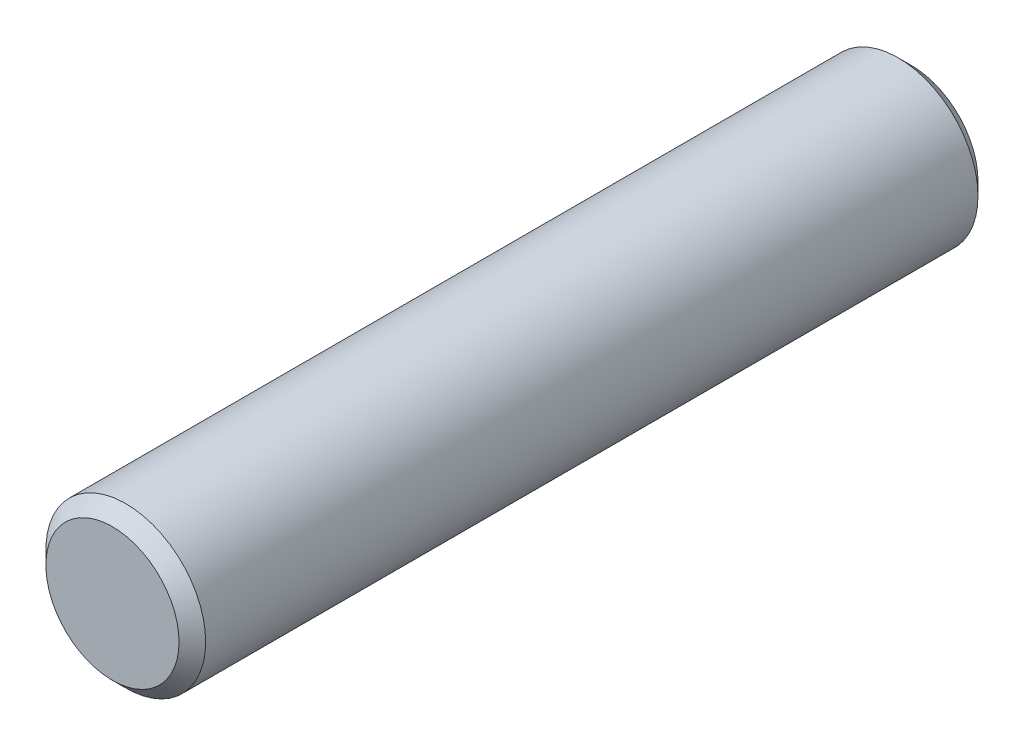
ISO-10303-21;
HEADER;
FILE_DESCRIPTION(('STEP AP214'),'2;1');
FILE_NAME('part.step','',(''),(''),'','','');
FILE_SCHEMA(('AUTOMOTIVE_DESIGN { 1 0 10303 214 1 1 1 1 }'));
ENDSEC;
DATA;
#1=APPLICATION_CONTEXT('core data for automotive mechanical design processes');
#2=APPLICATION_PROTOCOL_DEFINITION('international standard','automotive_design',2000,#1);
#3=PRODUCT_CONTEXT('',#1,'mechanical');
#4=PRODUCT('Part','Part','',(#3));
#5=PRODUCT_RELATED_PRODUCT_CATEGORY('part','',(#4));
#6=PRODUCT_DEFINITION_FORMATION('','',#4);
#7=PRODUCT_DEFINITION_CONTEXT('part definition',#1,'design');
#8=PRODUCT_DEFINITION('design','',#6,#7);
#9=PRODUCT_DEFINITION_SHAPE('','',#8);
#10=(LENGTH_UNIT() NAMED_UNIT(*) SI_UNIT(.MILLI.,.METRE.));
#11=(NAMED_UNIT(*) PLANE_ANGLE_UNIT() SI_UNIT($,.RADIAN.));
#12=(NAMED_UNIT(*) SI_UNIT($,.STERADIAN.) SOLID_ANGLE_UNIT());
#13=UNCERTAINTY_MEASURE_WITH_UNIT(LENGTH_MEASURE(1.E-05),#10,'distance_accuracy_value','');
#14=(GEOMETRIC_REPRESENTATION_CONTEXT(3) GLOBAL_UNCERTAINTY_ASSIGNED_CONTEXT((#13)) GLOBAL_UNIT_ASSIGNED_CONTEXT((#10,
#11,#12)) REPRESENTATION_CONTEXT('',''));
#15=CARTESIAN_POINT('',(0.,0.,0.));
#16=DIRECTION('',(0.,0.,1.));
#17=DIRECTION('',(1.,0.,0.));
#18=AXIS2_PLACEMENT_3D('',#15,#16,#17);
#19=CARTESIAN_POINT('',(0.,0.,30.));
#20=DIRECTION('',(0.,0.,-1.));
#21=DIRECTION('',(-1.,0.,0.));
#22=AXIS2_PLACEMENT_3D('',#19,#20,#21);
#23=CYLINDRICAL_SURFACE('',#22,3.);
#24=CARTESIAN_POINT('',(0.,0.,29.5));
#25=DIRECTION('',(0.,0.,1.));
#26=DIRECTION('',(1.,0.,0.));
#27=AXIS2_PLACEMENT_3D('',#24,#25,#26);
#28=CIRCLE('',#27,3.);
#29=CARTESIAN_POINT('',(3.,0.,29.5));
#30=VERTEX_POINT('',#29);
#31=EDGE_CURVE('E37',#30,#30,#28,.F.);
#32=ORIENTED_EDGE('',*,*,#31,.T.);
#33=EDGE_LOOP('',(#32));
#34=FACE_BOUND('',#33,.T.);
#35=CARTESIAN_POINT('',(0.,0.,0.500000000000007));
#36=DIRECTION('',(0.,0.,1.));
#37=DIRECTION('',(1.,0.,0.));
#38=AXIS2_PLACEMENT_3D('',#35,#36,#37);
#39=CIRCLE('',#38,3.);
#40=CARTESIAN_POINT('',(3.,0.,0.500000000000007));
#41=VERTEX_POINT('',#40);
#42=EDGE_CURVE('E41',#41,#41,#39,.T.);
#43=ORIENTED_EDGE('',*,*,#42,.T.);
#44=EDGE_LOOP('',(#43));
#45=FACE_BOUND('',#44,.T.);
#46=ADVANCED_FACE('F31',(#34,#45),#23,.T.);
#47=CARTESIAN_POINT('',(0.,0.,30.));
#48=DIRECTION('',(0.,0.,1.));
#49=DIRECTION('',(1.,0.,0.));
#50=AXIS2_PLACEMENT_3D('',#47,#48,#49);
#51=PLANE('',#50);
#52=CARTESIAN_POINT('',(0.,0.,30.));
#53=DIRECTION('',(0.,0.,1.));
#54=DIRECTION('',(1.,0.,0.));
#55=AXIS2_PLACEMENT_3D('',#52,#53,#54);
#56=CIRCLE('',#55,2.5);
#57=CARTESIAN_POINT('',(2.5,0.,30.));
#58=VERTEX_POINT('',#57);
#59=EDGE_CURVE('E45',#58,#58,#56,.T.);
#60=ORIENTED_EDGE('',*,*,#59,.T.);
#61=EDGE_LOOP('',(#60));
#62=FACE_BOUND('',#61,.T.);
#63=ADVANCED_FACE('F51',(#62),#51,.T.);
#64=CARTESIAN_POINT('',(0.,0.,0.));
#65=DIRECTION('',(0.,0.,1.));
#66=DIRECTION('',(1.,0.,0.));
#67=AXIS2_PLACEMENT_3D('',#64,#65,#66);
#68=PLANE('',#67);
#69=CARTESIAN_POINT('',(0.,0.,0.));
#70=DIRECTION('',(0.,0.,1.));
#71=DIRECTION('',(1.,0.,0.));
#72=AXIS2_PLACEMENT_3D('',#69,#70,#71);
#73=CIRCLE('',#72,2.5);
#74=CARTESIAN_POINT('',(2.5,0.,0.));
#75=VERTEX_POINT('',#74);
#76=EDGE_CURVE('E10',#75,#75,#73,.F.);
#77=ORIENTED_EDGE('',*,*,#76,.T.);
#78=EDGE_LOOP('',(#77));
#79=FACE_BOUND('',#78,.T.);
#80=ADVANCED_FACE('F56',(#79),#68,.F.);
#81=CARTESIAN_POINT('',(0.,0.,30.));
#82=DIRECTION('',(0.,0.,-1.));
#83=DIRECTION('',(-1.,0.,0.));
#84=AXIS2_PLACEMENT_3D('',#81,#82,#83);
#85=CONICAL_SURFACE('',#84,2.5,0.785398163397445);
#86=ORIENTED_EDGE('',*,*,#31,.F.);
#87=EDGE_LOOP('',(#86));
#88=FACE_BOUND('',#87,.T.);
#89=ORIENTED_EDGE('',*,*,#59,.F.);
#90=EDGE_LOOP('',(#89));
#91=FACE_BOUND('',#90,.T.);
#92=ADVANCED_FACE('F53',(#88,#91),#85,.T.);
#93=CARTESIAN_POINT('',(0.,0.,0.500000000000007));
#94=DIRECTION('',(0.,0.,1.));
#95=DIRECTION('',(1.,0.,0.));
#96=AXIS2_PLACEMENT_3D('',#93,#94,#95);
#97=CONICAL_SURFACE('',#96,3.,0.785398163397445);
#98=ORIENTED_EDGE('',*,*,#76,.F.);
#99=EDGE_LOOP('',(#98));
#100=FACE_BOUND('',#99,.T.);
#101=ORIENTED_EDGE('',*,*,#42,.F.);
#102=EDGE_LOOP('',(#101));
#103=FACE_BOUND('',#102,.T.);
#104=ADVANCED_FACE('F55',(#100,#103),#97,.T.);
#105=CLOSED_SHELL('',(#46,#63,#80,#92,#104));
#106=MANIFOLD_SOLID_BREP('B2',#105);
#107=ADVANCED_BREP_SHAPE_REPRESENTATION('',(#18,#106),#14);
#108=SHAPE_DEFINITION_REPRESENTATION(#9,#107);
ENDSEC;
END-ISO-10303-21;
